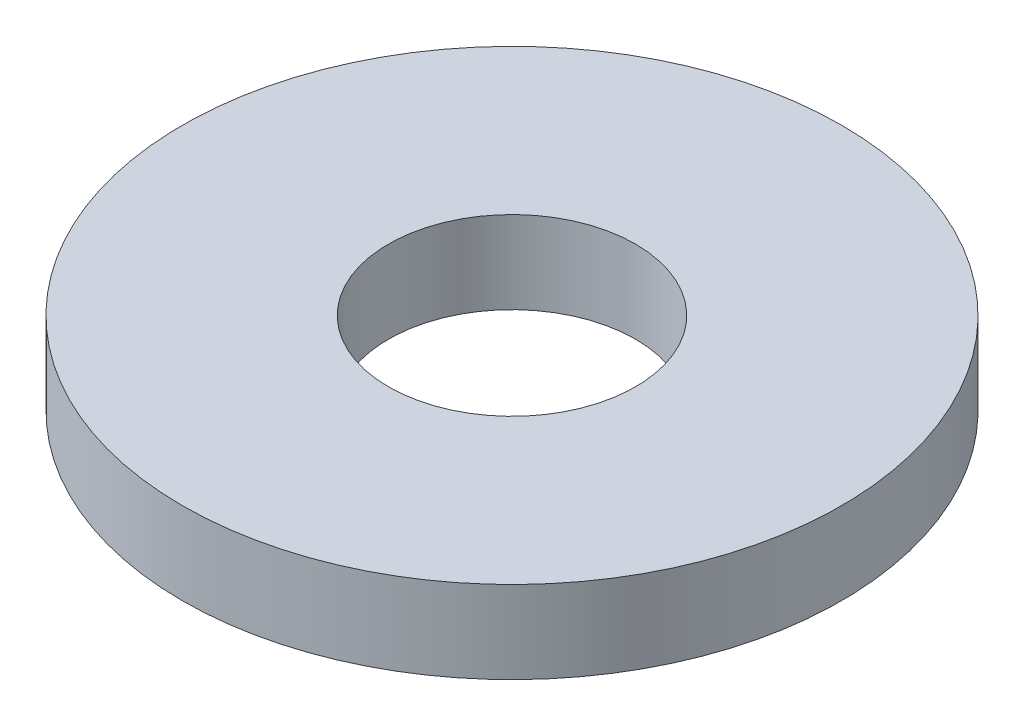
ISO-10303-21;
HEADER;
FILE_DESCRIPTION(('STEP AP214'),'2;1');
FILE_NAME('part.step','',(''),(''),'','','');
FILE_SCHEMA(('AUTOMOTIVE_DESIGN { 1 0 10303 214 1 1 1 1 }'));
ENDSEC;
DATA;
#1=APPLICATION_CONTEXT('core data for automotive mechanical design processes');
#2=APPLICATION_PROTOCOL_DEFINITION('international standard','automotive_design',2000,#1);
#3=PRODUCT_CONTEXT('',#1,'mechanical');
#4=PRODUCT('Part','Part','',(#3));
#5=PRODUCT_RELATED_PRODUCT_CATEGORY('part','',(#4));
#6=PRODUCT_DEFINITION_FORMATION('','',#4);
#7=PRODUCT_DEFINITION_CONTEXT('part definition',#1,'design');
#8=PRODUCT_DEFINITION('design','',#6,#7);
#9=PRODUCT_DEFINITION_SHAPE('','',#8);
#10=(LENGTH_UNIT() NAMED_UNIT(*) SI_UNIT(.MILLI.,.METRE.));
#11=(NAMED_UNIT(*) PLANE_ANGLE_UNIT() SI_UNIT($,.RADIAN.));
#12=(NAMED_UNIT(*) SI_UNIT($,.STERADIAN.) SOLID_ANGLE_UNIT());
#13=UNCERTAINTY_MEASURE_WITH_UNIT(LENGTH_MEASURE(1.E-05),#10,'distance_accuracy_value','');
#14=(GEOMETRIC_REPRESENTATION_CONTEXT(3) GLOBAL_UNCERTAINTY_ASSIGNED_CONTEXT((#13)) GLOBAL_UNIT_ASSIGNED_CONTEXT((#10,
#11,#12)) REPRESENTATION_CONTEXT('',''));
#15=CARTESIAN_POINT('',(0.,0.,0.));
#16=DIRECTION('',(0.,0.,1.));
#17=DIRECTION('',(1.,0.,0.));
#18=AXIS2_PLACEMENT_3D('',#15,#16,#17);
#19=CARTESIAN_POINT('',(0.,1.,0.));
#20=DIRECTION('',(0.,1.,0.));
#21=DIRECTION('',(0.,0.,1.));
#22=AXIS2_PLACEMENT_3D('',#19,#20,#21);
#23=PLANE('',#22);
#24=CARTESIAN_POINT('',(0.,1.,0.));
#25=DIRECTION('',(0.,1.,0.));
#26=DIRECTION('',(0.,0.,1.));
#27=AXIS2_PLACEMENT_3D('',#24,#25,#26);
#28=CIRCLE('',#27,4.);
#29=CARTESIAN_POINT('',(0.,1.,4.));
#30=VERTEX_POINT('',#29);
#31=EDGE_CURVE('E10',#30,#30,#28,.T.);
#32=ORIENTED_EDGE('',*,*,#31,.T.);
#33=EDGE_LOOP('',(#32));
#34=FACE_BOUND('',#33,.T.);
#35=CARTESIAN_POINT('',(0.,1.,0.));
#36=DIRECTION('',(0.,1.,0.));
#37=DIRECTION('',(0.,0.,1.));
#38=AXIS2_PLACEMENT_3D('',#35,#36,#37);
#39=CIRCLE('',#38,1.5);
#40=CARTESIAN_POINT('',(0.,1.,1.5));
#41=VERTEX_POINT('',#40);
#42=EDGE_CURVE('E46',#41,#41,#39,.T.);
#43=ORIENTED_EDGE('',*,*,#42,.F.);
#44=EDGE_LOOP('',(#43));
#45=FACE_BOUND('',#44,.T.);
#46=ADVANCED_FACE('F35',(#34,#45),#23,.T.);
#47=CARTESIAN_POINT('',(0.,0.,0.));
#48=DIRECTION('',(0.,1.,0.));
#49=DIRECTION('',(0.,0.,1.));
#50=AXIS2_PLACEMENT_3D('',#47,#48,#49);
#51=PLANE('',#50);
#52=CARTESIAN_POINT('',(0.,0.,0.));
#53=DIRECTION('',(0.,1.,0.));
#54=DIRECTION('',(0.,0.,1.));
#55=AXIS2_PLACEMENT_3D('',#52,#53,#54);
#56=CIRCLE('',#55,4.);
#57=CARTESIAN_POINT('',(0.,0.,4.));
#58=VERTEX_POINT('',#57);
#59=EDGE_CURVE('E39',#58,#58,#56,.T.);
#60=ORIENTED_EDGE('',*,*,#59,.F.);
#61=EDGE_LOOP('',(#60));
#62=FACE_BOUND('',#61,.T.);
#63=CARTESIAN_POINT('',(0.,0.,0.));
#64=DIRECTION('',(0.,1.,0.));
#65=DIRECTION('',(0.,0.,1.));
#66=AXIS2_PLACEMENT_3D('',#63,#64,#65);
#67=CIRCLE('',#66,1.5);
#68=CARTESIAN_POINT('',(0.,0.,1.5));
#69=VERTEX_POINT('',#68);
#70=EDGE_CURVE('E48',#69,#69,#67,.T.);
#71=ORIENTED_EDGE('',*,*,#70,.T.);
#72=EDGE_LOOP('',(#71));
#73=FACE_BOUND('',#72,.T.);
#74=ADVANCED_FACE('F58',(#62,#73),#51,.F.);
#75=CARTESIAN_POINT('',(0.,1.,0.));
#76=DIRECTION('',(0.,-1.,0.));
#77=DIRECTION('',(0.,0.,-1.));
#78=AXIS2_PLACEMENT_3D('',#75,#76,#77);
#79=CYLINDRICAL_SURFACE('',#78,4.);
#80=ORIENTED_EDGE('',*,*,#31,.F.);
#81=EDGE_LOOP('',(#80));
#82=FACE_BOUND('',#81,.T.);
#83=ORIENTED_EDGE('',*,*,#59,.T.);
#84=EDGE_LOOP('',(#83));
#85=FACE_BOUND('',#84,.T.);
#86=ADVANCED_FACE('F37',(#82,#85),#79,.T.);
#87=CARTESIAN_POINT('',(0.,1.,0.));
#88=DIRECTION('',(0.,-1.,0.));
#89=DIRECTION('',(0.,0.,-1.));
#90=AXIS2_PLACEMENT_3D('',#87,#88,#89);
#91=CYLINDRICAL_SURFACE('',#90,1.5);
#92=ORIENTED_EDGE('',*,*,#42,.T.);
#93=EDGE_LOOP('',(#92));
#94=FACE_BOUND('',#93,.T.);
#95=ORIENTED_EDGE('',*,*,#70,.F.);
#96=EDGE_LOOP('',(#95));
#97=FACE_BOUND('',#96,.T.);
#98=ADVANCED_FACE('F54',(#94,#97),#91,.F.);
#99=CLOSED_SHELL('',(#46,#74,#86,#98));
#100=MANIFOLD_SOLID_BREP('B2',#99);
#101=ADVANCED_BREP_SHAPE_REPRESENTATION('',(#18,#100),#14);
#102=SHAPE_DEFINITION_REPRESENTATION(#9,#101);
ENDSEC;
END-ISO-10303-21;
